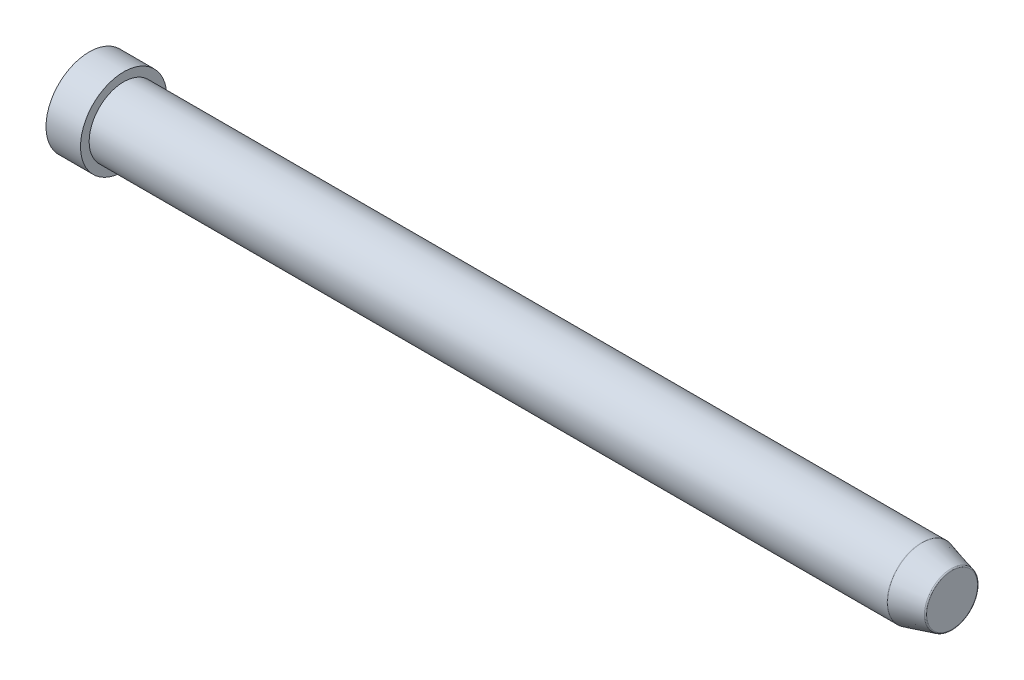
ISO-10303-21;
HEADER;
FILE_DESCRIPTION(('STEP AP214'),'2;1');
FILE_NAME('part.step','',(''),(''),'','','');
FILE_SCHEMA(('AUTOMOTIVE_DESIGN { 1 0 10303 214 1 1 1 1 }'));
ENDSEC;
DATA;
#1=APPLICATION_CONTEXT('core data for automotive mechanical design processes');
#2=APPLICATION_PROTOCOL_DEFINITION('international standard','automotive_design',2000,#1);
#3=PRODUCT_CONTEXT('',#1,'mechanical');
#4=PRODUCT('Part','Part','',(#3));
#5=PRODUCT_RELATED_PRODUCT_CATEGORY('part','',(#4));
#6=PRODUCT_DEFINITION_FORMATION('','',#4);
#7=PRODUCT_DEFINITION_CONTEXT('part definition',#1,'design');
#8=PRODUCT_DEFINITION('design','',#6,#7);
#9=PRODUCT_DEFINITION_SHAPE('','',#8);
#10=(LENGTH_UNIT() NAMED_UNIT(*) SI_UNIT(.MILLI.,.METRE.));
#11=(NAMED_UNIT(*) PLANE_ANGLE_UNIT() SI_UNIT($,.RADIAN.));
#12=(NAMED_UNIT(*) SI_UNIT($,.STERADIAN.) SOLID_ANGLE_UNIT());
#13=UNCERTAINTY_MEASURE_WITH_UNIT(LENGTH_MEASURE(1.E-05),#10,'distance_accuracy_value','');
#14=(GEOMETRIC_REPRESENTATION_CONTEXT(3) GLOBAL_UNCERTAINTY_ASSIGNED_CONTEXT((#13)) GLOBAL_UNIT_ASSIGNED_CONTEXT((#10,
#11,#12)) REPRESENTATION_CONTEXT('',''));
#15=CARTESIAN_POINT('',(0.,0.,0.));
#16=DIRECTION('',(0.,0.,1.));
#17=DIRECTION('',(1.,0.,0.));
#18=AXIS2_PLACEMENT_3D('',#15,#16,#17);
#19=CARTESIAN_POINT('',(0.,0.,0.));
#20=DIRECTION('',(1.,0.,0.));
#21=DIRECTION('',(0.,0.,-1.));
#22=AXIS2_PLACEMENT_3D('',#19,#20,#21);
#23=PLANE('',#22);
#24=CARTESIAN_POINT('',(0.,0.,0.));
#25=DIRECTION('',(-1.,0.,0.));
#26=DIRECTION('',(0.,0.,1.));
#27=AXIS2_PLACEMENT_3D('',#24,#25,#26);
#28=CIRCLE('',#27,10.);
#29=CARTESIAN_POINT('',(0.,0.,10.));
#30=VERTEX_POINT('',#29);
#31=EDGE_CURVE('E51',#30,#30,#28,.T.);
#32=ORIENTED_EDGE('',*,*,#31,.T.);
#33=EDGE_LOOP('',(#32));
#34=FACE_BOUND('',#33,.T.);
#35=ADVANCED_FACE('F31',(#34),#23,.F.);
#36=CARTESIAN_POINT('',(0.,0.,0.));
#37=DIRECTION('',(-1.,0.,0.));
#38=DIRECTION('',(0.,0.,1.));
#39=AXIS2_PLACEMENT_3D('',#36,#37,#38);
#40=CYLINDRICAL_SURFACE('',#39,10.);
#41=ORIENTED_EDGE('',*,*,#31,.F.);
#42=EDGE_LOOP('',(#41));
#43=FACE_BOUND('',#42,.T.);
#44=CARTESIAN_POINT('',(8.,0.,0.));
#45=DIRECTION('',(-1.,0.,0.));
#46=DIRECTION('',(0.,0.,1.));
#47=AXIS2_PLACEMENT_3D('',#44,#45,#46);
#48=CIRCLE('',#47,10.);
#49=CARTESIAN_POINT('',(8.,0.,10.));
#50=VERTEX_POINT('',#49);
#51=EDGE_CURVE('E54',#50,#50,#48,.T.);
#52=ORIENTED_EDGE('',*,*,#51,.T.);
#53=EDGE_LOOP('',(#52));
#54=FACE_BOUND('',#53,.T.);
#55=ADVANCED_FACE('F74',(#43,#54),#40,.T.);
#56=CARTESIAN_POINT('',(8.,10.,0.));
#57=DIRECTION('',(-1.,0.,0.));
#58=DIRECTION('',(0.,0.,1.));
#59=AXIS2_PLACEMENT_3D('',#56,#57,#58);
#60=PLANE('',#59);
#61=ORIENTED_EDGE('',*,*,#51,.F.);
#62=EDGE_LOOP('',(#61));
#63=FACE_BOUND('',#62,.T.);
#64=CARTESIAN_POINT('',(8.,0.,0.));
#65=DIRECTION('',(-1.,0.,0.));
#66=DIRECTION('',(0.,0.,1.));
#67=AXIS2_PLACEMENT_3D('',#64,#65,#66);
#68=CIRCLE('',#67,8.);
#69=CARTESIAN_POINT('',(8.,0.,8.));
#70=VERTEX_POINT('',#69);
#71=EDGE_CURVE('E57',#70,#70,#68,.T.);
#72=ORIENTED_EDGE('',*,*,#71,.T.);
#73=EDGE_LOOP('',(#72));
#74=FACE_BOUND('',#73,.T.);
#75=ADVANCED_FACE('F61',(#63,#74),#60,.F.);
#76=CARTESIAN_POINT('',(0.,0.,0.));
#77=DIRECTION('',(-1.,0.,0.));
#78=DIRECTION('',(0.,0.,1.));
#79=AXIS2_PLACEMENT_3D('',#76,#77,#78);
#80=CYLINDRICAL_SURFACE('',#79,8.);
#81=CARTESIAN_POINT('',(192.960504250724,0.,0.));
#82=DIRECTION('',(1.,0.,0.));
#83=DIRECTION('',(0.,0.,-1.));
#84=AXIS2_PLACEMENT_3D('',#81,#82,#83);
#85=CIRCLE('',#84,8.);
#86=CARTESIAN_POINT('',(192.960504250724,0.,-8.));
#87=VERTEX_POINT('',#86);
#88=EDGE_CURVE('E46',#87,#87,#85,.F.);
#89=ORIENTED_EDGE('',*,*,#88,.T.);
#90=EDGE_LOOP('',(#89));
#91=FACE_BOUND('',#90,.T.);
#92=ORIENTED_EDGE('',*,*,#71,.F.);
#93=EDGE_LOOP('',(#92));
#94=FACE_BOUND('',#93,.T.);
#95=ADVANCED_FACE('F63',(#91,#94),#80,.T.);
#96=CARTESIAN_POINT('',(200.,8.,0.));
#97=DIRECTION('',(-1.,0.,0.));
#98=DIRECTION('',(0.,0.,1.));
#99=AXIS2_PLACEMENT_3D('',#96,#97,#98);
#100=PLANE('',#99);
#101=CARTESIAN_POINT('',(200.,0.,0.));
#102=DIRECTION('',(-1.,0.,0.));
#103=DIRECTION('',(0.,0.,1.));
#104=AXIS2_PLACEMENT_3D('',#101,#102,#103);
#105=CIRCLE('',#104,5.89415755658844);
#106=CARTESIAN_POINT('',(200.,0.,5.89415755658844));
#107=VERTEX_POINT('',#106);
#108=EDGE_CURVE('E10',#107,#107,#105,.F.);
#109=ORIENTED_EDGE('',*,*,#108,.T.);
#110=EDGE_LOOP('',(#109));
#111=FACE_BOUND('',#110,.T.);
#112=ADVANCED_FACE('F65',(#111),#100,.F.);
#113=CARTESIAN_POINT('',(193.,0.,0.));
#114=DIRECTION('',(-1.,0.,0.));
#115=DIRECTION('',(0.,0.,1.));
#116=AXIS2_PLACEMENT_3D('',#113,#114,#115);
#117=CONICAL_SURFACE('',#116,8.,0.261799387799148);
#118=CARTESIAN_POINT('',(193.038149964254,0.,0.));
#119=DIRECTION('',(-1.,0.,0.));
#120=DIRECTION('',(0.,0.,1.));
#121=AXIS2_PLACEMENT_3D('',#118,#119,#120);
#122=CIRCLE('',#121,7.98977774788672);
#123=CARTESIAN_POINT('',(193.038149964254,0.,7.98977774788672));
#124=VERTEX_POINT('',#123);
#125=EDGE_CURVE('E38',#124,#124,#122,.F.);
#126=ORIENTED_EDGE('',*,*,#125,.T.);
#127=EDGE_LOOP('',(#126));
#128=FACE_BOUND('',#127,.T.);
#129=CARTESIAN_POINT('',(199.777645713531,0.,0.));
#130=DIRECTION('',(-1.,0.,0.));
#131=DIRECTION('',(0.,0.,1.));
#132=AXIS2_PLACEMENT_3D('',#129,#130,#131);
#133=CIRCLE('',#132,6.18393530447516);
#134=CARTESIAN_POINT('',(199.777645713531,0.,6.18393530447516));
#135=VERTEX_POINT('',#134);
#136=EDGE_CURVE('E42',#135,#135,#133,.T.);
#137=ORIENTED_EDGE('',*,*,#136,.T.);
#138=EDGE_LOOP('',(#137));
#139=FACE_BOUND('',#138,.T.);
#140=ADVANCED_FACE('F72',(#128,#139),#117,.T.);
#141=CARTESIAN_POINT('',(192.960504250724,0.,0.));
#142=DIRECTION('',(1.,0.,0.));
#143=DIRECTION('',(0.,0.,-1.));
#144=AXIS2_PLACEMENT_3D('',#141,#142,#143);
#145=TOROIDAL_SURFACE('',#144,7.7,0.3);
#146=ORIENTED_EDGE('',*,*,#125,.F.);
#147=EDGE_LOOP('',(#146));
#148=FACE_BOUND('',#147,.T.);
#149=ORIENTED_EDGE('',*,*,#88,.F.);
#150=EDGE_LOOP('',(#149));
#151=FACE_BOUND('',#150,.T.);
#152=ADVANCED_FACE('F87',(#148,#151),#145,.T.);
#153=CARTESIAN_POINT('',(199.7,0.,0.));
#154=DIRECTION('',(-1.,0.,0.));
#155=DIRECTION('',(0.,0.,1.));
#156=AXIS2_PLACEMENT_3D('',#153,#154,#155);
#157=TOROIDAL_SURFACE('',#156,5.89415755658844,0.3);
#158=ORIENTED_EDGE('',*,*,#136,.F.);
#159=EDGE_LOOP('',(#158));
#160=FACE_BOUND('',#159,.T.);
#161=ORIENTED_EDGE('',*,*,#108,.F.);
#162=EDGE_LOOP('',(#161));
#163=FACE_BOUND('',#162,.T.);
#164=ADVANCED_FACE('F33',(#160,#163),#157,.T.);
#165=CLOSED_SHELL('',(#35,#55,#75,#95,#112,#140,#152,#164));
#166=MANIFOLD_SOLID_BREP('B2',#165);
#167=ADVANCED_BREP_SHAPE_REPRESENTATION('',(#18,#166),#14);
#168=SHAPE_DEFINITION_REPRESENTATION(#9,#167);
ENDSEC;
END-ISO-10303-21;
